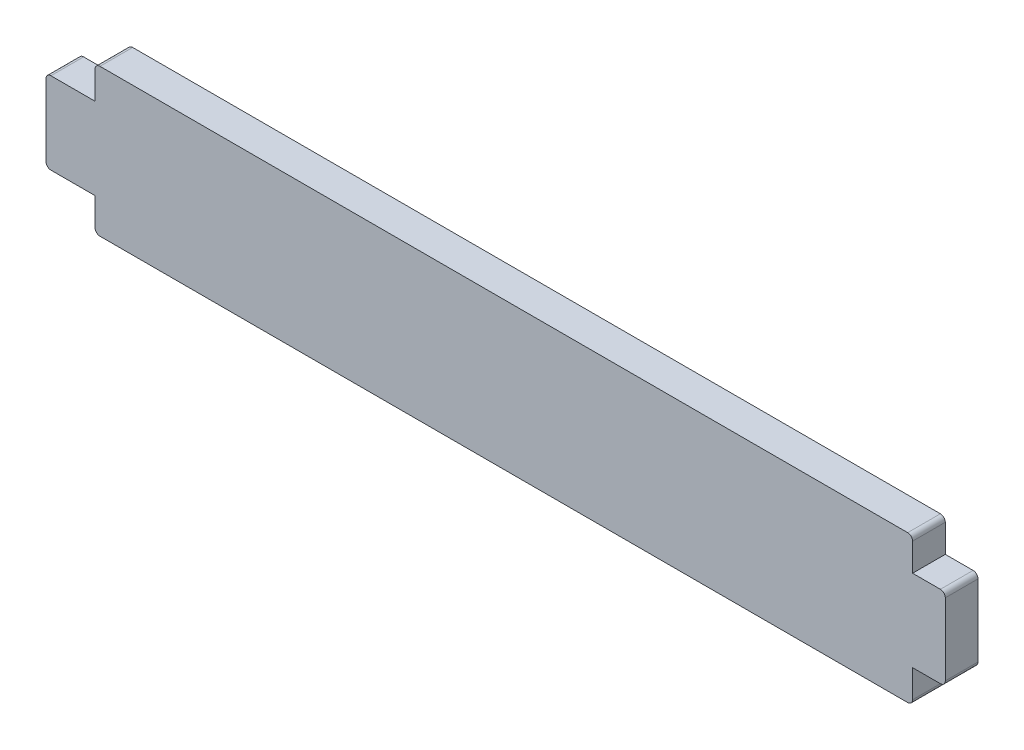
ISO-10303-21;
HEADER;
FILE_DESCRIPTION(('STEP AP214'),'2;1');
FILE_NAME('part.step','',(''),(''),'','','');
FILE_SCHEMA(('AUTOMOTIVE_DESIGN { 1 0 10303 214 1 1 1 1 }'));
ENDSEC;
DATA;
#1=APPLICATION_CONTEXT('core data for automotive mechanical design processes');
#2=APPLICATION_PROTOCOL_DEFINITION('international standard','automotive_design',2000,#1);
#3=PRODUCT_CONTEXT('',#1,'mechanical');
#4=PRODUCT('Part','Part','',(#3));
#5=PRODUCT_RELATED_PRODUCT_CATEGORY('part','',(#4));
#6=PRODUCT_DEFINITION_FORMATION('','',#4);
#7=PRODUCT_DEFINITION_CONTEXT('part definition',#1,'design');
#8=PRODUCT_DEFINITION('design','',#6,#7);
#9=PRODUCT_DEFINITION_SHAPE('','',#8);
#10=(LENGTH_UNIT() NAMED_UNIT(*) SI_UNIT(.MILLI.,.METRE.));
#11=(NAMED_UNIT(*) PLANE_ANGLE_UNIT() SI_UNIT($,.RADIAN.));
#12=(NAMED_UNIT(*) SI_UNIT($,.STERADIAN.) SOLID_ANGLE_UNIT());
#13=UNCERTAINTY_MEASURE_WITH_UNIT(LENGTH_MEASURE(1.E-05),#10,'distance_accuracy_value','');
#14=(GEOMETRIC_REPRESENTATION_CONTEXT(3) GLOBAL_UNCERTAINTY_ASSIGNED_CONTEXT((#13)) GLOBAL_UNIT_ASSIGNED_CONTEXT((#10,
#11,#12)) REPRESENTATION_CONTEXT('',''));
#15=CARTESIAN_POINT('',(0.,0.,0.));
#16=DIRECTION('',(0.,0.,1.));
#17=DIRECTION('',(1.,0.,0.));
#18=AXIS2_PLACEMENT_3D('',#15,#16,#17);
#19=CARTESIAN_POINT('',(0.,-4.5,2.));
#20=DIRECTION('',(0.,1.,0.));
#21=DIRECTION('',(0.,0.,1.));
#22=AXIS2_PLACEMENT_3D('',#19,#20,#21);
#23=PLANE('',#22);
#24=DIRECTION('',(1.,0.,0.));
#25=VECTOR('',#24,1.);
#26=CARTESIAN_POINT('',(0.,-4.5,0.));
#27=LINE('',#26,#25);
#28=CARTESIAN_POINT('',(-24.2,-4.5,0.));
#29=VERTEX_POINT('',#28);
#30=CARTESIAN_POINT('',(25.2,-4.5,0.));
#31=VERTEX_POINT('',#30);
#32=EDGE_CURVE('E321',#29,#31,#27,.T.);
#33=ORIENTED_EDGE('',*,*,#32,.T.);
#34=DIRECTION('',(0.,0.,-1.));
#35=VECTOR('',#34,1.);
#36=CARTESIAN_POINT('',(25.2,-4.5,2.));
#37=LINE('',#36,#35);
#38=CARTESIAN_POINT('',(25.2,-4.5,2.));
#39=VERTEX_POINT('',#38);
#40=EDGE_CURVE('E235',#31,#39,#37,.F.);
#41=ORIENTED_EDGE('',*,*,#40,.T.);
#42=DIRECTION('',(1.,0.,0.));
#43=VECTOR('',#42,1.);
#44=CARTESIAN_POINT('',(0.,-4.5,2.));
#45=LINE('',#44,#43);
#46=CARTESIAN_POINT('',(-24.2,-4.5,2.));
#47=VERTEX_POINT('',#46);
#48=EDGE_CURVE('E191',#47,#39,#45,.T.);
#49=ORIENTED_EDGE('',*,*,#48,.F.);
#50=DIRECTION('',(0.,0.,-1.));
#51=VECTOR('',#50,1.);
#52=CARTESIAN_POINT('',(-24.2,-4.5,0.));
#53=LINE('',#52,#51);
#54=EDGE_CURVE('E213',#47,#29,#53,.T.);
#55=ORIENTED_EDGE('',*,*,#54,.T.);
#56=EDGE_LOOP('',(#33,#41,#49,#55));
#57=FACE_BOUND('',#56,.T.);
#58=ADVANCED_FACE('F35',(#57),#23,.F.);
#59=CARTESIAN_POINT('',(25.5,0.,2.));
#60=DIRECTION('',(-1.,0.,0.));
#61=DIRECTION('',(0.,0.,1.));
#62=AXIS2_PLACEMENT_3D('',#59,#60,#61);
#63=PLANE('',#62);
#64=DIRECTION('',(0.,1.,0.));
#65=VECTOR('',#64,1.);
#66=CARTESIAN_POINT('',(25.5,0.,2.));
#67=LINE('',#66,#65);
#68=CARTESIAN_POINT('',(25.5,-4.2,2.));
#69=VERTEX_POINT('',#68);
#70=CARTESIAN_POINT('',(25.5,-2.5,2.));
#71=VERTEX_POINT('',#70);
#72=EDGE_CURVE('E181',#69,#71,#67,.T.);
#73=ORIENTED_EDGE('',*,*,#72,.F.);
#74=DIRECTION('',(0.,0.,-1.));
#75=VECTOR('',#74,1.);
#76=CARTESIAN_POINT('',(25.5,-4.2,2.));
#77=LINE('',#76,#75);
#78=CARTESIAN_POINT('',(25.5,-4.2,0.));
#79=VERTEX_POINT('',#78);
#80=EDGE_CURVE('E231',#69,#79,#77,.T.);
#81=ORIENTED_EDGE('',*,*,#80,.T.);
#82=DIRECTION('',(0.,1.,0.));
#83=VECTOR('',#82,1.);
#84=CARTESIAN_POINT('',(25.5,0.,0.));
#85=LINE('',#84,#83);
#86=CARTESIAN_POINT('',(25.5,-2.5,0.));
#87=VERTEX_POINT('',#86);
#88=EDGE_CURVE('E196',#79,#87,#85,.T.);
#89=ORIENTED_EDGE('',*,*,#88,.T.);
#90=DIRECTION('',(0.,0.,-1.));
#91=VECTOR('',#90,1.);
#92=CARTESIAN_POINT('',(25.5,-2.5,2.));
#93=LINE('',#92,#91);
#94=EDGE_CURVE('E175',#71,#87,#93,.T.);
#95=ORIENTED_EDGE('',*,*,#94,.F.);
#96=EDGE_LOOP('',(#73,#81,#89,#95));
#97=FACE_BOUND('',#96,.T.);
#98=ADVANCED_FACE('F194',(#97),#63,.F.);
#99=CARTESIAN_POINT('',(0.,-2.5,2.));
#100=DIRECTION('',(0.,-1.,0.));
#101=DIRECTION('',(0.,0.,-1.));
#102=AXIS2_PLACEMENT_3D('',#99,#100,#101);
#103=PLANE('',#102);
#104=DIRECTION('',(-1.,0.,0.));
#105=VECTOR('',#104,1.);
#106=CARTESIAN_POINT('',(0.,-2.5,0.));
#107=LINE('',#106,#105);
#108=CARTESIAN_POINT('',(27.2,-2.5,0.));
#109=VERTEX_POINT('',#108);
#110=EDGE_CURVE('E318',#109,#87,#107,.T.);
#111=ORIENTED_EDGE('',*,*,#110,.F.);
#112=DIRECTION('',(0.,0.,-1.));
#113=VECTOR('',#112,1.);
#114=CARTESIAN_POINT('',(27.2,-2.5,2.));
#115=LINE('',#114,#113);
#116=CARTESIAN_POINT('',(27.2,-2.5,2.));
#117=VERTEX_POINT('',#116);
#118=EDGE_CURVE('E177',#109,#117,#115,.F.);
#119=ORIENTED_EDGE('',*,*,#118,.T.);
#120=DIRECTION('',(-1.,0.,0.));
#121=VECTOR('',#120,1.);
#122=CARTESIAN_POINT('',(0.,-2.5,2.));
#123=LINE('',#122,#121);
#124=EDGE_CURVE('E170',#117,#71,#123,.T.);
#125=ORIENTED_EDGE('',*,*,#124,.T.);
#126=ORIENTED_EDGE('',*,*,#94,.T.);
#127=EDGE_LOOP('',(#111,#119,#125,#126));
#128=FACE_BOUND('',#127,.T.);
#129=ADVANCED_FACE('F173',(#128),#103,.T.);
#130=CARTESIAN_POINT('',(27.5,0.,2.));
#131=DIRECTION('',(-1.,0.,0.));
#132=DIRECTION('',(0.,0.,1.));
#133=AXIS2_PLACEMENT_3D('',#130,#131,#132);
#134=PLANE('',#133);
#135=DIRECTION('',(0.,1.,0.));
#136=VECTOR('',#135,1.);
#137=CARTESIAN_POINT('',(27.5,0.,0.));
#138=LINE('',#137,#136);
#139=CARTESIAN_POINT('',(27.5,-2.2,0.));
#140=VERTEX_POINT('',#139);
#141=CARTESIAN_POINT('',(27.5,2.2,0.));
#142=VERTEX_POINT('',#141);
#143=EDGE_CURVE('E315',#140,#142,#138,.T.);
#144=ORIENTED_EDGE('',*,*,#143,.T.);
#145=DIRECTION('',(0.,0.,-1.));
#146=VECTOR('',#145,1.);
#147=CARTESIAN_POINT('',(27.5,2.2,2.));
#148=LINE('',#147,#146);
#149=CARTESIAN_POINT('',(27.5,2.2,2.));
#150=VERTEX_POINT('',#149);
#151=EDGE_CURVE('E261',#142,#150,#148,.F.);
#152=ORIENTED_EDGE('',*,*,#151,.T.);
#153=DIRECTION('',(0.,1.,0.));
#154=VECTOR('',#153,1.);
#155=CARTESIAN_POINT('',(27.5,0.,2.));
#156=LINE('',#155,#154);
#157=CARTESIAN_POINT('',(27.5,-2.2,2.));
#158=VERTEX_POINT('',#157);
#159=EDGE_CURVE('E180',#158,#150,#156,.T.);
#160=ORIENTED_EDGE('',*,*,#159,.F.);
#161=DIRECTION('',(0.,0.,-1.));
#162=VECTOR('',#161,1.);
#163=CARTESIAN_POINT('',(27.5,-2.2,0.));
#164=LINE('',#163,#162);
#165=EDGE_CURVE('E258',#158,#140,#164,.T.);
#166=ORIENTED_EDGE('',*,*,#165,.T.);
#167=EDGE_LOOP('',(#144,#152,#160,#166));
#168=FACE_BOUND('',#167,.T.);
#169=ADVANCED_FACE('F357',(#168),#134,.F.);
#170=CARTESIAN_POINT('',(0.,2.5,2.));
#171=DIRECTION('',(0.,-1.,0.));
#172=DIRECTION('',(1.,0.,0.));
#173=AXIS2_PLACEMENT_3D('',#170,#171,#172);
#174=PLANE('',#173);
#175=DIRECTION('',(-1.,0.,0.));
#176=VECTOR('',#175,1.);
#177=CARTESIAN_POINT('',(0.,2.5,2.));
#178=LINE('',#177,#176);
#179=CARTESIAN_POINT('',(27.2,2.5,2.));
#180=VERTEX_POINT('',#179);
#181=CARTESIAN_POINT('',(25.5,2.5,2.));
#182=VERTEX_POINT('',#181);
#183=EDGE_CURVE('E337',#180,#182,#178,.T.);
#184=ORIENTED_EDGE('',*,*,#183,.F.);
#185=DIRECTION('',(0.,0.,-1.));
#186=VECTOR('',#185,1.);
#187=CARTESIAN_POINT('',(27.2,2.5,2.));
#188=LINE('',#187,#186);
#189=CARTESIAN_POINT('',(27.2,2.5,0.));
#190=VERTEX_POINT('',#189);
#191=EDGE_CURVE('E255',#180,#190,#188,.T.);
#192=ORIENTED_EDGE('',*,*,#191,.T.);
#193=DIRECTION('',(-1.,0.,0.));
#194=VECTOR('',#193,1.);
#195=CARTESIAN_POINT('',(0.,2.5,0.));
#196=LINE('',#195,#194);
#197=CARTESIAN_POINT('',(25.5,2.5,0.));
#198=VERTEX_POINT('',#197);
#199=EDGE_CURVE('E313',#190,#198,#196,.T.);
#200=ORIENTED_EDGE('',*,*,#199,.T.);
#201=DIRECTION('',(0.,0.,-1.));
#202=VECTOR('',#201,1.);
#203=CARTESIAN_POINT('',(25.5,2.5,2.));
#204=LINE('',#203,#202);
#205=EDGE_CURVE('E198',#182,#198,#204,.T.);
#206=ORIENTED_EDGE('',*,*,#205,.F.);
#207=EDGE_LOOP('',(#184,#192,#200,#206));
#208=FACE_BOUND('',#207,.T.);
#209=ADVANCED_FACE('F366',(#208),#174,.F.);
#210=CARTESIAN_POINT('',(25.5,0.,2.));
#211=DIRECTION('',(1.,0.,0.));
#212=DIRECTION('',(0.,0.,-1.));
#213=AXIS2_PLACEMENT_3D('',#210,#211,#212);
#214=PLANE('',#213);
#215=DIRECTION('',(0.,-1.,0.));
#216=VECTOR('',#215,1.);
#217=CARTESIAN_POINT('',(25.5,0.,0.));
#218=LINE('',#217,#216);
#219=CARTESIAN_POINT('',(25.5,4.2,0.));
#220=VERTEX_POINT('',#219);
#221=EDGE_CURVE('E308',#220,#198,#218,.T.);
#222=ORIENTED_EDGE('',*,*,#221,.F.);
#223=DIRECTION('',(0.,0.,-1.));
#224=VECTOR('',#223,1.);
#225=CARTESIAN_POINT('',(25.5,4.2,2.));
#226=LINE('',#225,#224);
#227=CARTESIAN_POINT('',(25.5,4.2,2.));
#228=VERTEX_POINT('',#227);
#229=EDGE_CURVE('E247',#220,#228,#226,.F.);
#230=ORIENTED_EDGE('',*,*,#229,.T.);
#231=DIRECTION('',(0.,-1.,0.));
#232=VECTOR('',#231,1.);
#233=CARTESIAN_POINT('',(25.5,0.,2.));
#234=LINE('',#233,#232);
#235=EDGE_CURVE('E334',#228,#182,#234,.T.);
#236=ORIENTED_EDGE('',*,*,#235,.T.);
#237=ORIENTED_EDGE('',*,*,#205,.T.);
#238=EDGE_LOOP('',(#222,#230,#236,#237));
#239=FACE_BOUND('',#238,.T.);
#240=ADVANCED_FACE('F370',(#239),#214,.T.);
#241=CARTESIAN_POINT('',(0.,4.5,2.));
#242=DIRECTION('',(0.,1.,0.));
#243=DIRECTION('',(0.,0.,1.));
#244=AXIS2_PLACEMENT_3D('',#241,#242,#243);
#245=PLANE('',#244);
#246=DIRECTION('',(1.,0.,0.));
#247=VECTOR('',#246,1.);
#248=CARTESIAN_POINT('',(0.,4.5,2.));
#249=LINE('',#248,#247);
#250=CARTESIAN_POINT('',(-24.2,4.5,2.));
#251=VERTEX_POINT('',#250);
#252=CARTESIAN_POINT('',(25.2,4.5,2.));
#253=VERTEX_POINT('',#252);
#254=EDGE_CURVE('E331',#251,#253,#249,.T.);
#255=ORIENTED_EDGE('',*,*,#254,.T.);
#256=DIRECTION('',(0.,0.,-1.));
#257=VECTOR('',#256,1.);
#258=CARTESIAN_POINT('',(25.2,4.5,2.));
#259=LINE('',#258,#257);
#260=CARTESIAN_POINT('',(25.2,4.5,0.));
#261=VERTEX_POINT('',#260);
#262=EDGE_CURVE('E238',#253,#261,#259,.T.);
#263=ORIENTED_EDGE('',*,*,#262,.T.);
#264=DIRECTION('',(1.,0.,0.));
#265=VECTOR('',#264,1.);
#266=CARTESIAN_POINT('',(0.,4.5,0.));
#267=LINE('',#266,#265);
#268=CARTESIAN_POINT('',(-24.2,4.5,0.));
#269=VERTEX_POINT('',#268);
#270=EDGE_CURVE('E306',#269,#261,#267,.T.);
#271=ORIENTED_EDGE('',*,*,#270,.F.);
#272=DIRECTION('',(0.,0.,-1.));
#273=VECTOR('',#272,1.);
#274=CARTESIAN_POINT('',(-24.2,4.5,2.));
#275=LINE('',#274,#273);
#276=EDGE_CURVE('E227',#269,#251,#275,.F.);
#277=ORIENTED_EDGE('',*,*,#276,.T.);
#278=EDGE_LOOP('',(#255,#263,#271,#277));
#279=FACE_BOUND('',#278,.T.);
#280=ADVANCED_FACE('F379',(#279),#245,.T.);
#281=CARTESIAN_POINT('',(-24.5,0.,2.));
#282=DIRECTION('',(1.,0.,0.));
#283=DIRECTION('',(0.,0.,-1.));
#284=AXIS2_PLACEMENT_3D('',#281,#282,#283);
#285=PLANE('',#284);
#286=DIRECTION('',(0.,-1.,0.));
#287=VECTOR('',#286,1.);
#288=CARTESIAN_POINT('',(-24.5,0.,2.));
#289=LINE('',#288,#287);
#290=CARTESIAN_POINT('',(-24.5,4.2,2.));
#291=VERTEX_POINT('',#290);
#292=CARTESIAN_POINT('',(-24.5,2.5,2.));
#293=VERTEX_POINT('',#292);
#294=EDGE_CURVE('E303',#291,#293,#289,.T.);
#295=ORIENTED_EDGE('',*,*,#294,.F.);
#296=DIRECTION('',(0.,0.,-1.));
#297=VECTOR('',#296,1.);
#298=CARTESIAN_POINT('',(-24.5,4.2,0.));
#299=LINE('',#298,#297);
#300=CARTESIAN_POINT('',(-24.5,4.2,0.));
#301=VERTEX_POINT('',#300);
#302=EDGE_CURVE('E222',#291,#301,#299,.T.);
#303=ORIENTED_EDGE('',*,*,#302,.T.);
#304=DIRECTION('',(0.,-1.,0.));
#305=VECTOR('',#304,1.);
#306=CARTESIAN_POINT('',(-24.5,0.,0.));
#307=LINE('',#306,#305);
#308=CARTESIAN_POINT('',(-24.5,2.5,0.));
#309=VERTEX_POINT('',#308);
#310=EDGE_CURVE('E286',#301,#309,#307,.T.);
#311=ORIENTED_EDGE('',*,*,#310,.T.);
#312=DIRECTION('',(0.,0.,-1.));
#313=VECTOR('',#312,1.);
#314=CARTESIAN_POINT('',(-24.5,2.5,2.));
#315=LINE('',#314,#313);
#316=EDGE_CURVE('E204',#293,#309,#315,.T.);
#317=ORIENTED_EDGE('',*,*,#316,.F.);
#318=EDGE_LOOP('',(#295,#303,#311,#317));
#319=FACE_BOUND('',#318,.T.);
#320=ADVANCED_FACE('F302',(#319),#285,.F.);
#321=CARTESIAN_POINT('',(0.,2.5,2.));
#322=DIRECTION('',(0.,1.,0.));
#323=DIRECTION('',(0.,0.,1.));
#324=AXIS2_PLACEMENT_3D('',#321,#322,#323);
#325=PLANE('',#324);
#326=DIRECTION('',(1.,0.,0.));
#327=VECTOR('',#326,1.);
#328=CARTESIAN_POINT('',(0.,2.5,0.));
#329=LINE('',#328,#327);
#330=CARTESIAN_POINT('',(-27.2,2.5,0.));
#331=VERTEX_POINT('',#330);
#332=EDGE_CURVE('E281',#331,#309,#329,.T.);
#333=ORIENTED_EDGE('',*,*,#332,.F.);
#334=DIRECTION('',(0.,0.,-1.));
#335=VECTOR('',#334,1.);
#336=CARTESIAN_POINT('',(-27.2,2.5,2.));
#337=LINE('',#336,#335);
#338=CARTESIAN_POINT('',(-27.2,2.5,2.));
#339=VERTEX_POINT('',#338);
#340=EDGE_CURVE('E43',#331,#339,#337,.F.);
#341=ORIENTED_EDGE('',*,*,#340,.T.);
#342=DIRECTION('',(1.,0.,0.));
#343=VECTOR('',#342,1.);
#344=CARTESIAN_POINT('',(0.,2.5,2.));
#345=LINE('',#344,#343);
#346=EDGE_CURVE('E297',#339,#293,#345,.T.);
#347=ORIENTED_EDGE('',*,*,#346,.T.);
#348=ORIENTED_EDGE('',*,*,#316,.T.);
#349=EDGE_LOOP('',(#333,#341,#347,#348));
#350=FACE_BOUND('',#349,.T.);
#351=ADVANCED_FACE('F296',(#350),#325,.T.);
#352=CARTESIAN_POINT('',(-27.5,0.,2.));
#353=DIRECTION('',(-1.,0.,0.));
#354=DIRECTION('',(0.,0.,1.));
#355=AXIS2_PLACEMENT_3D('',#352,#353,#354);
#356=PLANE('',#355);
#357=DIRECTION('',(0.,1.,0.));
#358=VECTOR('',#357,1.);
#359=CARTESIAN_POINT('',(-27.5,0.,2.));
#360=LINE('',#359,#358);
#361=CARTESIAN_POINT('',(-27.5,-2.2,2.));
#362=VERTEX_POINT('',#361);
#363=CARTESIAN_POINT('',(-27.5,2.2,2.));
#364=VERTEX_POINT('',#363);
#365=EDGE_CURVE('E275',#362,#364,#360,.T.);
#366=ORIENTED_EDGE('',*,*,#365,.T.);
#367=DIRECTION('',(0.,0.,-1.));
#368=VECTOR('',#367,1.);
#369=CARTESIAN_POINT('',(-27.5,2.2,2.));
#370=LINE('',#369,#368);
#371=CARTESIAN_POINT('',(-27.5,2.2,0.));
#372=VERTEX_POINT('',#371);
#373=EDGE_CURVE('E264',#364,#372,#370,.T.);
#374=ORIENTED_EDGE('',*,*,#373,.T.);
#375=DIRECTION('',(0.,1.,0.));
#376=VECTOR('',#375,1.);
#377=CARTESIAN_POINT('',(-27.5,0.,0.));
#378=LINE('',#377,#376);
#379=CARTESIAN_POINT('',(-27.5,-2.2,0.));
#380=VERTEX_POINT('',#379);
#381=EDGE_CURVE('E272',#380,#372,#378,.T.);
#382=ORIENTED_EDGE('',*,*,#381,.F.);
#383=DIRECTION('',(0.,0.,-1.));
#384=VECTOR('',#383,1.);
#385=CARTESIAN_POINT('',(-27.5,-2.2,2.));
#386=LINE('',#385,#384);
#387=EDGE_CURVE('E209',#380,#362,#386,.F.);
#388=ORIENTED_EDGE('',*,*,#387,.T.);
#389=EDGE_LOOP('',(#366,#374,#382,#388));
#390=FACE_BOUND('',#389,.T.);
#391=ADVANCED_FACE('F271',(#390),#356,.T.);
#392=CARTESIAN_POINT('',(0.,-2.5,2.));
#393=DIRECTION('',(0.,1.,0.));
#394=DIRECTION('',(0.,0.,1.));
#395=AXIS2_PLACEMENT_3D('',#392,#393,#394);
#396=PLANE('',#395);
#397=DIRECTION('',(1.,0.,0.));
#398=VECTOR('',#397,1.);
#399=CARTESIAN_POINT('',(0.,-2.5,2.));
#400=LINE('',#399,#398);
#401=CARTESIAN_POINT('',(-27.2,-2.5,2.));
#402=VERTEX_POINT('',#401);
#403=CARTESIAN_POINT('',(-24.5,-2.5,2.));
#404=VERTEX_POINT('',#403);
#405=EDGE_CURVE('E325',#402,#404,#400,.T.);
#406=ORIENTED_EDGE('',*,*,#405,.F.);
#407=DIRECTION('',(0.,0.,-1.));
#408=VECTOR('',#407,1.);
#409=CARTESIAN_POINT('',(-27.2,-2.5,0.));
#410=LINE('',#409,#408);
#411=CARTESIAN_POINT('',(-27.2,-2.5,0.));
#412=VERTEX_POINT('',#411);
#413=EDGE_CURVE('E197',#402,#412,#410,.T.);
#414=ORIENTED_EDGE('',*,*,#413,.T.);
#415=DIRECTION('',(1.,0.,0.));
#416=VECTOR('',#415,1.);
#417=CARTESIAN_POINT('',(0.,-2.5,0.));
#418=LINE('',#417,#416);
#419=CARTESIAN_POINT('',(-24.5,-2.5,0.));
#420=VERTEX_POINT('',#419);
#421=EDGE_CURVE('E280',#412,#420,#418,.T.);
#422=ORIENTED_EDGE('',*,*,#421,.T.);
#423=DIRECTION('',(0.,0.,-1.));
#424=VECTOR('',#423,1.);
#425=CARTESIAN_POINT('',(-24.5,-2.5,2.));
#426=LINE('',#425,#424);
#427=EDGE_CURVE('E291',#404,#420,#426,.T.);
#428=ORIENTED_EDGE('',*,*,#427,.F.);
#429=EDGE_LOOP('',(#406,#414,#422,#428));
#430=FACE_BOUND('',#429,.T.);
#431=ADVANCED_FACE('F439',(#430),#396,.F.);
#432=CARTESIAN_POINT('',(-24.5,0.,2.));
#433=DIRECTION('',(-1.,0.,0.));
#434=DIRECTION('',(0.,0.,1.));
#435=AXIS2_PLACEMENT_3D('',#432,#433,#434);
#436=PLANE('',#435);
#437=DIRECTION('',(0.,1.,0.));
#438=VECTOR('',#437,1.);
#439=CARTESIAN_POINT('',(-24.5,0.,0.));
#440=LINE('',#439,#438);
#441=CARTESIAN_POINT('',(-24.5,-4.2,0.));
#442=VERTEX_POINT('',#441);
#443=EDGE_CURVE('E284',#442,#420,#440,.T.);
#444=ORIENTED_EDGE('',*,*,#443,.F.);
#445=DIRECTION('',(0.,0.,-1.));
#446=VECTOR('',#445,1.);
#447=CARTESIAN_POINT('',(-24.5,-4.2,2.));
#448=LINE('',#447,#446);
#449=CARTESIAN_POINT('',(-24.5,-4.2,2.));
#450=VERTEX_POINT('',#449);
#451=EDGE_CURVE('E218',#442,#450,#448,.F.);
#452=ORIENTED_EDGE('',*,*,#451,.T.);
#453=DIRECTION('',(0.,1.,0.));
#454=VECTOR('',#453,1.);
#455=CARTESIAN_POINT('',(-24.5,0.,2.));
#456=LINE('',#455,#454);
#457=EDGE_CURVE('E293',#450,#404,#456,.T.);
#458=ORIENTED_EDGE('',*,*,#457,.T.);
#459=ORIENTED_EDGE('',*,*,#427,.T.);
#460=EDGE_LOOP('',(#444,#452,#458,#459));
#461=FACE_BOUND('',#460,.T.);
#462=ADVANCED_FACE('F450',(#461),#436,.T.);
#463=CARTESIAN_POINT('',(0.,0.,2.));
#464=DIRECTION('',(0.,0.,1.));
#465=DIRECTION('',(1.,0.,0.));
#466=AXIS2_PLACEMENT_3D('',#463,#464,#465);
#467=PLANE('',#466);
#468=ORIENTED_EDGE('',*,*,#346,.F.);
#469=CARTESIAN_POINT('',(-27.2,2.2,2.));
#470=DIRECTION('',(0.,0.,1.));
#471=DIRECTION('',(1.,0.,0.));
#472=AXIS2_PLACEMENT_3D('',#469,#470,#471);
#473=CIRCLE('',#472,0.3);
#474=EDGE_CURVE('E11',#339,#364,#473,.T.);
#475=ORIENTED_EDGE('',*,*,#474,.T.);
#476=ORIENTED_EDGE('',*,*,#365,.F.);
#477=CARTESIAN_POINT('',(-27.2,-2.2,2.));
#478=DIRECTION('',(0.,0.,1.));
#479=DIRECTION('',(1.,0.,0.));
#480=AXIS2_PLACEMENT_3D('',#477,#478,#479);
#481=CIRCLE('',#480,0.3);
#482=EDGE_CURVE('E211',#362,#402,#481,.T.);
#483=ORIENTED_EDGE('',*,*,#482,.T.);
#484=ORIENTED_EDGE('',*,*,#405,.T.);
#485=ORIENTED_EDGE('',*,*,#457,.F.);
#486=CARTESIAN_POINT('',(-24.2,-4.2,2.));
#487=DIRECTION('',(0.,0.,1.));
#488=DIRECTION('',(1.,0.,0.));
#489=AXIS2_PLACEMENT_3D('',#486,#487,#488);
#490=CIRCLE('',#489,0.3);
#491=EDGE_CURVE('E220',#450,#47,#490,.T.);
#492=ORIENTED_EDGE('',*,*,#491,.T.);
#493=ORIENTED_EDGE('',*,*,#48,.T.);
#494=CARTESIAN_POINT('',(25.2,-4.2,2.));
#495=DIRECTION('',(0.,0.,1.));
#496=DIRECTION('',(1.,0.,0.));
#497=AXIS2_PLACEMENT_3D('',#494,#495,#496);
#498=CIRCLE('',#497,0.3);
#499=EDGE_CURVE('E187',#39,#69,#498,.T.);
#500=ORIENTED_EDGE('',*,*,#499,.T.);
#501=ORIENTED_EDGE('',*,*,#72,.T.);
#502=ORIENTED_EDGE('',*,*,#124,.F.);
#503=CARTESIAN_POINT('',(27.2,-2.2,2.));
#504=DIRECTION('',(0.,0.,1.));
#505=DIRECTION('',(1.,0.,0.));
#506=AXIS2_PLACEMENT_3D('',#503,#504,#505);
#507=CIRCLE('',#506,0.3);
#508=EDGE_CURVE('E249',#117,#158,#507,.T.);
#509=ORIENTED_EDGE('',*,*,#508,.T.);
#510=ORIENTED_EDGE('',*,*,#159,.T.);
#511=CARTESIAN_POINT('',(27.2,2.2,2.));
#512=DIRECTION('',(0.,0.,1.));
#513=DIRECTION('',(1.,0.,0.));
#514=AXIS2_PLACEMENT_3D('',#511,#512,#513);
#515=CIRCLE('',#514,0.3);
#516=EDGE_CURVE('E251',#150,#180,#515,.T.);
#517=ORIENTED_EDGE('',*,*,#516,.T.);
#518=ORIENTED_EDGE('',*,*,#183,.T.);
#519=ORIENTED_EDGE('',*,*,#235,.F.);
#520=CARTESIAN_POINT('',(25.2,4.2,2.));
#521=DIRECTION('',(0.,0.,1.));
#522=DIRECTION('',(1.,0.,0.));
#523=AXIS2_PLACEMENT_3D('',#520,#521,#522);
#524=CIRCLE('',#523,0.3);
#525=EDGE_CURVE('E253',#228,#253,#524,.T.);
#526=ORIENTED_EDGE('',*,*,#525,.T.);
#527=ORIENTED_EDGE('',*,*,#254,.F.);
#528=CARTESIAN_POINT('',(-24.2,4.2,2.));
#529=DIRECTION('',(0.,0.,1.));
#530=DIRECTION('',(1.,0.,0.));
#531=AXIS2_PLACEMENT_3D('',#528,#529,#530);
#532=CIRCLE('',#531,0.3);
#533=EDGE_CURVE('E229',#251,#291,#532,.T.);
#534=ORIENTED_EDGE('',*,*,#533,.T.);
#535=ORIENTED_EDGE('',*,*,#294,.T.);
#536=EDGE_LOOP('',(#468,#475,#476,#483,#484,#485,#492,#493,#500,#501,#502,#509,#510,#517,#518,
#519,#526,#527,#534,#535));
#537=FACE_BOUND('',#536,.T.);
#538=ADVANCED_FACE('F184',(#537),#467,.T.);
#539=CARTESIAN_POINT('',(0.,0.,0.));
#540=DIRECTION('',(0.,0.,1.));
#541=DIRECTION('',(1.,0.,0.));
#542=AXIS2_PLACEMENT_3D('',#539,#540,#541);
#543=PLANE('',#542);
#544=ORIENTED_EDGE('',*,*,#381,.T.);
#545=CARTESIAN_POINT('',(-27.2,2.2,0.));
#546=DIRECTION('',(0.,0.,1.));
#547=DIRECTION('',(1.,0.,0.));
#548=AXIS2_PLACEMENT_3D('',#545,#546,#547);
#549=CIRCLE('',#548,0.3);
#550=EDGE_CURVE('E57',#372,#331,#549,.F.);
#551=ORIENTED_EDGE('',*,*,#550,.T.);
#552=ORIENTED_EDGE('',*,*,#332,.T.);
#553=ORIENTED_EDGE('',*,*,#310,.F.);
#554=CARTESIAN_POINT('',(-24.2,4.2,0.));
#555=DIRECTION('',(0.,0.,1.));
#556=DIRECTION('',(1.,0.,0.));
#557=AXIS2_PLACEMENT_3D('',#554,#555,#556);
#558=CIRCLE('',#557,0.3);
#559=EDGE_CURVE('E225',#301,#269,#558,.F.);
#560=ORIENTED_EDGE('',*,*,#559,.T.);
#561=ORIENTED_EDGE('',*,*,#270,.T.);
#562=CARTESIAN_POINT('',(25.2,4.2,0.));
#563=DIRECTION('',(0.,0.,1.));
#564=DIRECTION('',(1.,0.,0.));
#565=AXIS2_PLACEMENT_3D('',#562,#563,#564);
#566=CIRCLE('',#565,0.3);
#567=EDGE_CURVE('E245',#261,#220,#566,.F.);
#568=ORIENTED_EDGE('',*,*,#567,.T.);
#569=ORIENTED_EDGE('',*,*,#221,.T.);
#570=ORIENTED_EDGE('',*,*,#199,.F.);
#571=CARTESIAN_POINT('',(27.2,2.2,0.));
#572=DIRECTION('',(0.,0.,1.));
#573=DIRECTION('',(1.,0.,0.));
#574=AXIS2_PLACEMENT_3D('',#571,#572,#573);
#575=CIRCLE('',#574,0.3);
#576=EDGE_CURVE('E243',#190,#142,#575,.F.);
#577=ORIENTED_EDGE('',*,*,#576,.T.);
#578=ORIENTED_EDGE('',*,*,#143,.F.);
#579=CARTESIAN_POINT('',(27.2,-2.2,0.));
#580=DIRECTION('',(0.,0.,1.));
#581=DIRECTION('',(1.,0.,0.));
#582=AXIS2_PLACEMENT_3D('',#579,#580,#581);
#583=CIRCLE('',#582,0.3);
#584=EDGE_CURVE('E241',#140,#109,#583,.F.);
#585=ORIENTED_EDGE('',*,*,#584,.T.);
#586=ORIENTED_EDGE('',*,*,#110,.T.);
#587=ORIENTED_EDGE('',*,*,#88,.F.);
#588=CARTESIAN_POINT('',(25.2,-4.2,0.));
#589=DIRECTION('',(0.,0.,1.));
#590=DIRECTION('',(1.,0.,0.));
#591=AXIS2_PLACEMENT_3D('',#588,#589,#590);
#592=CIRCLE('',#591,0.3);
#593=EDGE_CURVE('E233',#79,#31,#592,.F.);
#594=ORIENTED_EDGE('',*,*,#593,.T.);
#595=ORIENTED_EDGE('',*,*,#32,.F.);
#596=CARTESIAN_POINT('',(-24.2,-4.2,0.));
#597=DIRECTION('',(0.,0.,1.));
#598=DIRECTION('',(1.,0.,0.));
#599=AXIS2_PLACEMENT_3D('',#596,#597,#598);
#600=CIRCLE('',#599,0.3);
#601=EDGE_CURVE('E216',#29,#442,#600,.F.);
#602=ORIENTED_EDGE('',*,*,#601,.T.);
#603=ORIENTED_EDGE('',*,*,#443,.T.);
#604=ORIENTED_EDGE('',*,*,#421,.F.);
#605=CARTESIAN_POINT('',(-27.2,-2.2,0.));
#606=DIRECTION('',(0.,0.,1.));
#607=DIRECTION('',(1.,0.,0.));
#608=AXIS2_PLACEMENT_3D('',#605,#606,#607);
#609=CIRCLE('',#608,0.3);
#610=EDGE_CURVE('E201',#412,#380,#609,.F.);
#611=ORIENTED_EDGE('',*,*,#610,.T.);
#612=EDGE_LOOP('',(#544,#551,#552,#553,#560,#561,#568,#569,#570,#577,#578,#585,#586,#587,#594,
#595,#602,#603,#604,#611));
#613=FACE_BOUND('',#612,.T.);
#614=ADVANCED_FACE('F278',(#613),#543,.F.);
#615=CARTESIAN_POINT('',(-27.2,-2.2,2.));
#616=DIRECTION('',(0.,0.,1.));
#617=DIRECTION('',(1.,0.,0.));
#618=AXIS2_PLACEMENT_3D('',#615,#616,#617);
#619=CYLINDRICAL_SURFACE('',#618,0.3);
#620=ORIENTED_EDGE('',*,*,#482,.F.);
#621=ORIENTED_EDGE('',*,*,#387,.F.);
#622=ORIENTED_EDGE('',*,*,#610,.F.);
#623=ORIENTED_EDGE('',*,*,#413,.F.);
#624=EDGE_LOOP('',(#620,#621,#622,#623));
#625=FACE_BOUND('',#624,.T.);
#626=ADVANCED_FACE('F396',(#625),#619,.T.);
#627=CARTESIAN_POINT('',(-24.2,-4.2,2.));
#628=DIRECTION('',(0.,0.,1.));
#629=DIRECTION('',(1.,0.,0.));
#630=AXIS2_PLACEMENT_3D('',#627,#628,#629);
#631=CYLINDRICAL_SURFACE('',#630,0.3);
#632=ORIENTED_EDGE('',*,*,#491,.F.);
#633=ORIENTED_EDGE('',*,*,#451,.F.);
#634=ORIENTED_EDGE('',*,*,#601,.F.);
#635=ORIENTED_EDGE('',*,*,#54,.F.);
#636=EDGE_LOOP('',(#632,#633,#634,#635));
#637=FACE_BOUND('',#636,.T.);
#638=ADVANCED_FACE('F399',(#637),#631,.T.);
#639=CARTESIAN_POINT('',(-24.2,4.2,2.));
#640=DIRECTION('',(0.,0.,1.));
#641=DIRECTION('',(1.,0.,0.));
#642=AXIS2_PLACEMENT_3D('',#639,#640,#641);
#643=CYLINDRICAL_SURFACE('',#642,0.3);
#644=ORIENTED_EDGE('',*,*,#533,.F.);
#645=ORIENTED_EDGE('',*,*,#276,.F.);
#646=ORIENTED_EDGE('',*,*,#559,.F.);
#647=ORIENTED_EDGE('',*,*,#302,.F.);
#648=EDGE_LOOP('',(#644,#645,#646,#647));
#649=FACE_BOUND('',#648,.T.);
#650=ADVANCED_FACE('F383',(#649),#643,.T.);
#651=CARTESIAN_POINT('',(25.2,-4.2,2.));
#652=DIRECTION('',(0.,0.,-1.));
#653=DIRECTION('',(-1.,0.,0.));
#654=AXIS2_PLACEMENT_3D('',#651,#652,#653);
#655=CYLINDRICAL_SURFACE('',#654,0.3);
#656=ORIENTED_EDGE('',*,*,#499,.F.);
#657=ORIENTED_EDGE('',*,*,#40,.F.);
#658=ORIENTED_EDGE('',*,*,#593,.F.);
#659=ORIENTED_EDGE('',*,*,#80,.F.);
#660=EDGE_LOOP('',(#656,#657,#658,#659));
#661=FACE_BOUND('',#660,.T.);
#662=ADVANCED_FACE('F348',(#661),#655,.T.);
#663=CARTESIAN_POINT('',(25.2,4.2,2.));
#664=DIRECTION('',(0.,0.,-1.));
#665=DIRECTION('',(-1.,0.,0.));
#666=AXIS2_PLACEMENT_3D('',#663,#664,#665);
#667=CYLINDRICAL_SURFACE('',#666,0.3);
#668=ORIENTED_EDGE('',*,*,#525,.F.);
#669=ORIENTED_EDGE('',*,*,#229,.F.);
#670=ORIENTED_EDGE('',*,*,#567,.F.);
#671=ORIENTED_EDGE('',*,*,#262,.F.);
#672=EDGE_LOOP('',(#668,#669,#670,#671));
#673=FACE_BOUND('',#672,.T.);
#674=ADVANCED_FACE('F376',(#673),#667,.T.);
#675=CARTESIAN_POINT('',(27.2,2.2,2.));
#676=DIRECTION('',(0.,0.,-1.));
#677=DIRECTION('',(-1.,0.,0.));
#678=AXIS2_PLACEMENT_3D('',#675,#676,#677);
#679=CYLINDRICAL_SURFACE('',#678,0.3);
#680=ORIENTED_EDGE('',*,*,#516,.F.);
#681=ORIENTED_EDGE('',*,*,#151,.F.);
#682=ORIENTED_EDGE('',*,*,#576,.F.);
#683=ORIENTED_EDGE('',*,*,#191,.F.);
#684=EDGE_LOOP('',(#680,#681,#682,#683));
#685=FACE_BOUND('',#684,.T.);
#686=ADVANCED_FACE('F360',(#685),#679,.T.);
#687=CARTESIAN_POINT('',(27.2,-2.2,2.));
#688=DIRECTION('',(0.,0.,1.));
#689=DIRECTION('',(1.,0.,0.));
#690=AXIS2_PLACEMENT_3D('',#687,#688,#689);
#691=CYLINDRICAL_SURFACE('',#690,0.3);
#692=ORIENTED_EDGE('',*,*,#508,.F.);
#693=ORIENTED_EDGE('',*,*,#118,.F.);
#694=ORIENTED_EDGE('',*,*,#584,.F.);
#695=ORIENTED_EDGE('',*,*,#165,.F.);
#696=EDGE_LOOP('',(#692,#693,#694,#695));
#697=FACE_BOUND('',#696,.T.);
#698=ADVANCED_FACE('F352',(#697),#691,.T.);
#699=CARTESIAN_POINT('',(-27.2,2.2,2.));
#700=DIRECTION('',(0.,0.,-1.));
#701=DIRECTION('',(-1.,0.,0.));
#702=AXIS2_PLACEMENT_3D('',#699,#700,#701);
#703=CYLINDRICAL_SURFACE('',#702,0.3);
#704=ORIENTED_EDGE('',*,*,#474,.F.);
#705=ORIENTED_EDGE('',*,*,#340,.F.);
#706=ORIENTED_EDGE('',*,*,#550,.F.);
#707=ORIENTED_EDGE('',*,*,#373,.F.);
#708=EDGE_LOOP('',(#704,#705,#706,#707));
#709=FACE_BOUND('',#708,.T.);
#710=ADVANCED_FACE('F37',(#709),#703,.T.);
#711=CLOSED_SHELL('',(#58,#98,#129,#169,#209,#240,#280,#320,#351,#391,#431,#462,#538,#614,#626,
#638,#650,#662,#674,#686,#698,#710));
#712=MANIFOLD_SOLID_BREP('B2',#711);
#713=ADVANCED_BREP_SHAPE_REPRESENTATION('',(#18,#712),#14);
#714=SHAPE_DEFINITION_REPRESENTATION(#9,#713);
ENDSEC;
END-ISO-10303-21;
